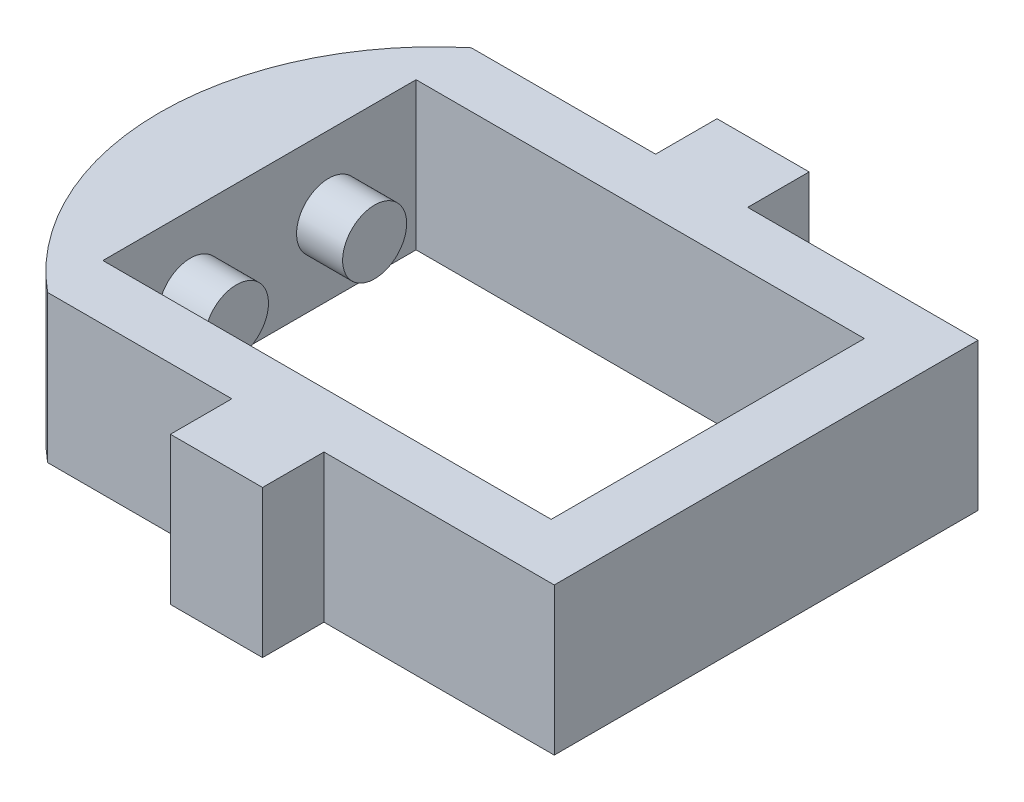
ISO-10303-21;
HEADER;
FILE_DESCRIPTION(('STEP AP214'),'2;1');
FILE_NAME('part.step','',(''),(''),'','','');
FILE_SCHEMA(('AUTOMOTIVE_DESIGN { 1 0 10303 214 1 1 1 1 }'));
ENDSEC;
DATA;
#1=APPLICATION_CONTEXT('core data for automotive mechanical design processes');
#2=APPLICATION_PROTOCOL_DEFINITION('international standard','automotive_design',2000,#1);
#3=PRODUCT_CONTEXT('',#1,'mechanical');
#4=PRODUCT('Part','Part','',(#3));
#5=PRODUCT_RELATED_PRODUCT_CATEGORY('part','',(#4));
#6=PRODUCT_DEFINITION_FORMATION('','',#4);
#7=PRODUCT_DEFINITION_CONTEXT('part definition',#1,'design');
#8=PRODUCT_DEFINITION('design','',#6,#7);
#9=PRODUCT_DEFINITION_SHAPE('','',#8);
#10=(LENGTH_UNIT() NAMED_UNIT(*) SI_UNIT(.MILLI.,.METRE.));
#11=(NAMED_UNIT(*) PLANE_ANGLE_UNIT() SI_UNIT($,.RADIAN.));
#12=(NAMED_UNIT(*) SI_UNIT($,.STERADIAN.) SOLID_ANGLE_UNIT());
#13=UNCERTAINTY_MEASURE_WITH_UNIT(LENGTH_MEASURE(1.E-05),#10,'distance_accuracy_value','');
#14=(GEOMETRIC_REPRESENTATION_CONTEXT(3) GLOBAL_UNCERTAINTY_ASSIGNED_CONTEXT((#13)) GLOBAL_UNIT_ASSIGNED_CONTEXT((#10,
#11,#12)) REPRESENTATION_CONTEXT('',''));
#15=CARTESIAN_POINT('',(0.,0.,0.));
#16=DIRECTION('',(0.,0.,1.));
#17=DIRECTION('',(1.,0.,0.));
#18=AXIS2_PLACEMENT_3D('',#15,#16,#17);
#19=CARTESIAN_POINT('',(0.,9.6,-13.8));
#20=DIRECTION('',(0.,0.,-1.));
#21=DIRECTION('',(-1.,0.,0.));
#22=AXIS2_PLACEMENT_3D('',#19,#20,#21);
#23=PLANE('',#22);
#24=DIRECTION('',(1.,0.,0.));
#25=VECTOR('',#24,1.);
#26=CARTESIAN_POINT('',(0.,0.,-13.8));
#27=LINE('',#26,#25);
#28=CARTESIAN_POINT('',(-17.9999999999994,0.,-13.8));
#29=VERTEX_POINT('',#28);
#30=CARTESIAN_POINT('',(-5.99999999999999,0.,-13.8));
#31=VERTEX_POINT('',#30);
#32=EDGE_CURVE('E214',#29,#31,#27,.T.);
#33=ORIENTED_EDGE('',*,*,#32,.F.);
#34=DIRECTION('',(0.,-1.,0.));
#35=VECTOR('',#34,1.);
#36=CARTESIAN_POINT('',(-17.9999999999994,9.6,-13.8));
#37=LINE('',#36,#35);
#38=CARTESIAN_POINT('',(-17.9999999999994,9.6,-13.8));
#39=VERTEX_POINT('',#38);
#40=EDGE_CURVE('E11',#39,#29,#37,.T.);
#41=ORIENTED_EDGE('',*,*,#40,.F.);
#42=DIRECTION('',(1.,0.,0.));
#43=VECTOR('',#42,1.);
#44=CARTESIAN_POINT('',(0.,9.6,-13.8));
#45=LINE('',#44,#43);
#46=CARTESIAN_POINT('',(-5.99999999999999,9.6,-13.8));
#47=VERTEX_POINT('',#46);
#48=EDGE_CURVE('E322',#39,#47,#45,.T.);
#49=ORIENTED_EDGE('',*,*,#48,.T.);
#50=DIRECTION('',(0.,-1.,0.));
#51=VECTOR('',#50,1.);
#52=CARTESIAN_POINT('',(-5.99999999999999,9.6,-13.8));
#53=LINE('',#52,#51);
#54=EDGE_CURVE('E64',#47,#31,#53,.T.);
#55=ORIENTED_EDGE('',*,*,#54,.T.);
#56=EDGE_LOOP('',(#33,#41,#49,#55));
#57=FACE_BOUND('',#56,.T.);
#58=ADVANCED_FACE('F44',(#57),#23,.T.);
#59=CARTESIAN_POINT('',(-6.60076923076862,9.6,0.));
#60=DIRECTION('',(0.,-1.,0.));
#61=DIRECTION('',(0.,0.,-1.));
#62=AXIS2_PLACEMENT_3D('',#59,#60,#61);
#63=CYLINDRICAL_SURFACE('',#62,17.8992307692308);
#64=CARTESIAN_POINT('',(-6.60076923076862,0.,0.));
#65=DIRECTION('',(0.,1.,0.));
#66=DIRECTION('',(0.,0.,1.));
#67=AXIS2_PLACEMENT_3D('',#64,#65,#66);
#68=CIRCLE('',#67,17.8992307692308);
#69=CARTESIAN_POINT('',(-17.9999999999994,0.,13.8));
#70=VERTEX_POINT('',#69);
#71=EDGE_CURVE('E217',#29,#70,#68,.T.);
#72=ORIENTED_EDGE('',*,*,#71,.T.);
#73=DIRECTION('',(0.,-1.,0.));
#74=VECTOR('',#73,1.);
#75=CARTESIAN_POINT('',(-17.9999999999994,9.6,13.8));
#76=LINE('',#75,#74);
#77=CARTESIAN_POINT('',(-17.9999999999994,9.6,13.8));
#78=VERTEX_POINT('',#77);
#79=EDGE_CURVE('E55',#78,#70,#76,.T.);
#80=ORIENTED_EDGE('',*,*,#79,.F.);
#81=CARTESIAN_POINT('',(-6.60076923076862,9.6,0.));
#82=DIRECTION('',(0.,1.,0.));
#83=DIRECTION('',(0.,0.,1.));
#84=AXIS2_PLACEMENT_3D('',#81,#82,#83);
#85=CIRCLE('',#84,17.8992307692308);
#86=EDGE_CURVE('E332',#39,#78,#85,.T.);
#87=ORIENTED_EDGE('',*,*,#86,.F.);
#88=ORIENTED_EDGE('',*,*,#40,.T.);
#89=EDGE_LOOP('',(#72,#80,#87,#88));
#90=FACE_BOUND('',#89,.T.);
#91=ADVANCED_FACE('F378',(#90),#63,.T.);
#92=CARTESIAN_POINT('',(0.,9.6,13.8));
#93=DIRECTION('',(0.,0.,-1.));
#94=DIRECTION('',(-1.,0.,0.));
#95=AXIS2_PLACEMENT_3D('',#92,#93,#94);
#96=PLANE('',#95);
#97=DIRECTION('',(1.,0.,0.));
#98=VECTOR('',#97,1.);
#99=CARTESIAN_POINT('',(0.,0.,13.8));
#100=LINE('',#99,#98);
#101=CARTESIAN_POINT('',(-5.99999999999999,0.,13.8));
#102=VERTEX_POINT('',#101);
#103=EDGE_CURVE('E221',#70,#102,#100,.T.);
#104=ORIENTED_EDGE('',*,*,#103,.T.);
#105=DIRECTION('',(0.,-1.,0.));
#106=VECTOR('',#105,1.);
#107=CARTESIAN_POINT('',(-5.99999999999999,9.6,13.8));
#108=LINE('',#107,#106);
#109=CARTESIAN_POINT('',(-5.99999999999999,9.6,13.8));
#110=VERTEX_POINT('',#109);
#111=EDGE_CURVE('E285',#110,#102,#108,.T.);
#112=ORIENTED_EDGE('',*,*,#111,.F.);
#113=DIRECTION('',(1.,0.,0.));
#114=VECTOR('',#113,1.);
#115=CARTESIAN_POINT('',(0.,9.6,13.8));
#116=LINE('',#115,#114);
#117=EDGE_CURVE('E336',#78,#110,#116,.T.);
#118=ORIENTED_EDGE('',*,*,#117,.F.);
#119=ORIENTED_EDGE('',*,*,#79,.T.);
#120=EDGE_LOOP('',(#104,#112,#118,#119));
#121=FACE_BOUND('',#120,.T.);
#122=ADVANCED_FACE('F383',(#121),#96,.F.);
#123=CARTESIAN_POINT('',(-5.99999999999996,9.6,0.));
#124=DIRECTION('',(1.,0.,0.));
#125=DIRECTION('',(0.,0.,-1.));
#126=AXIS2_PLACEMENT_3D('',#123,#124,#125);
#127=PLANE('',#126);
#128=DIRECTION('',(0.,0.,1.));
#129=VECTOR('',#128,1.);
#130=CARTESIAN_POINT('',(-5.99999999999996,0.,0.));
#131=LINE('',#130,#129);
#132=CARTESIAN_POINT('',(-6.,0.,17.8));
#133=VERTEX_POINT('',#132);
#134=EDGE_CURVE('E225',#102,#133,#131,.T.);
#135=ORIENTED_EDGE('',*,*,#134,.T.);
#136=DIRECTION('',(0.,-1.,0.));
#137=VECTOR('',#136,1.);
#138=CARTESIAN_POINT('',(-6.,9.6,17.8));
#139=LINE('',#138,#137);
#140=CARTESIAN_POINT('',(-6.,9.6,17.8));
#141=VERTEX_POINT('',#140);
#142=EDGE_CURVE('E281',#141,#133,#139,.T.);
#143=ORIENTED_EDGE('',*,*,#142,.F.);
#144=DIRECTION('',(0.,0.,1.));
#145=VECTOR('',#144,1.);
#146=CARTESIAN_POINT('',(-5.99999999999996,9.6,0.));
#147=LINE('',#146,#145);
#148=EDGE_CURVE('E340',#110,#141,#147,.T.);
#149=ORIENTED_EDGE('',*,*,#148,.F.);
#150=ORIENTED_EDGE('',*,*,#111,.T.);
#151=EDGE_LOOP('',(#135,#143,#149,#150));
#152=FACE_BOUND('',#151,.T.);
#153=ADVANCED_FACE('F417',(#152),#127,.F.);
#154=CARTESIAN_POINT('',(0.,9.6,17.8));
#155=DIRECTION('',(0.,0.,-1.));
#156=DIRECTION('',(-1.,0.,0.));
#157=AXIS2_PLACEMENT_3D('',#154,#155,#156);
#158=PLANE('',#157);
#159=DIRECTION('',(1.,0.,0.));
#160=VECTOR('',#159,1.);
#161=CARTESIAN_POINT('',(0.,0.,17.8));
#162=LINE('',#161,#160);
#163=CARTESIAN_POINT('',(0.,0.,17.8));
#164=VERTEX_POINT('',#163);
#165=EDGE_CURVE('E229',#133,#164,#162,.T.);
#166=ORIENTED_EDGE('',*,*,#165,.T.);
#167=DIRECTION('',(0.,-1.,0.));
#168=VECTOR('',#167,1.);
#169=CARTESIAN_POINT('',(0.,9.6,17.8));
#170=LINE('',#169,#168);
#171=CARTESIAN_POINT('',(0.,9.6,17.8));
#172=VERTEX_POINT('',#171);
#173=EDGE_CURVE('E277',#172,#164,#170,.T.);
#174=ORIENTED_EDGE('',*,*,#173,.F.);
#175=DIRECTION('',(1.,0.,0.));
#176=VECTOR('',#175,1.);
#177=CARTESIAN_POINT('',(0.,9.6,17.8));
#178=LINE('',#177,#176);
#179=EDGE_CURVE('E344',#141,#172,#178,.T.);
#180=ORIENTED_EDGE('',*,*,#179,.F.);
#181=ORIENTED_EDGE('',*,*,#142,.T.);
#182=EDGE_LOOP('',(#166,#174,#180,#181));
#183=FACE_BOUND('',#182,.T.);
#184=ADVANCED_FACE('F413',(#183),#158,.F.);
#185=CARTESIAN_POINT('',(0.,9.6,0.));
#186=DIRECTION('',(-1.,0.,0.));
#187=DIRECTION('',(0.,0.,1.));
#188=AXIS2_PLACEMENT_3D('',#185,#186,#187);
#189=PLANE('',#188);
#190=DIRECTION('',(0.,0.,-1.));
#191=VECTOR('',#190,1.);
#192=CARTESIAN_POINT('',(0.,0.,0.));
#193=LINE('',#192,#191);
#194=CARTESIAN_POINT('',(0.,0.,13.8));
#195=VERTEX_POINT('',#194);
#196=EDGE_CURVE('E233',#164,#195,#193,.T.);
#197=ORIENTED_EDGE('',*,*,#196,.T.);
#198=DIRECTION('',(0.,-1.,0.));
#199=VECTOR('',#198,1.);
#200=CARTESIAN_POINT('',(0.,9.6,13.8));
#201=LINE('',#200,#199);
#202=CARTESIAN_POINT('',(0.,9.6,13.8));
#203=VERTEX_POINT('',#202);
#204=EDGE_CURVE('E273',#203,#195,#201,.T.);
#205=ORIENTED_EDGE('',*,*,#204,.F.);
#206=DIRECTION('',(0.,0.,-1.));
#207=VECTOR('',#206,1.);
#208=CARTESIAN_POINT('',(0.,9.6,0.));
#209=LINE('',#208,#207);
#210=EDGE_CURVE('E348',#172,#203,#209,.T.);
#211=ORIENTED_EDGE('',*,*,#210,.F.);
#212=ORIENTED_EDGE('',*,*,#173,.T.);
#213=EDGE_LOOP('',(#197,#205,#211,#212));
#214=FACE_BOUND('',#213,.T.);
#215=ADVANCED_FACE('F409',(#214),#189,.F.);
#216=CARTESIAN_POINT('',(0.,9.6,13.8));
#217=DIRECTION('',(0.,0.,-1.));
#218=DIRECTION('',(-1.,0.,0.));
#219=AXIS2_PLACEMENT_3D('',#216,#217,#218);
#220=PLANE('',#219);
#221=DIRECTION('',(1.,0.,0.));
#222=VECTOR('',#221,1.);
#223=CARTESIAN_POINT('',(0.,0.,13.8));
#224=LINE('',#223,#222);
#225=CARTESIAN_POINT('',(15.,0.,13.8));
#226=VERTEX_POINT('',#225);
#227=EDGE_CURVE('E237',#195,#226,#224,.T.);
#228=ORIENTED_EDGE('',*,*,#227,.T.);
#229=DIRECTION('',(0.,-1.,0.));
#230=VECTOR('',#229,1.);
#231=CARTESIAN_POINT('',(15.,9.6,13.8));
#232=LINE('',#231,#230);
#233=CARTESIAN_POINT('',(15.,9.6,13.8));
#234=VERTEX_POINT('',#233);
#235=EDGE_CURVE('E269',#234,#226,#232,.T.);
#236=ORIENTED_EDGE('',*,*,#235,.F.);
#237=DIRECTION('',(1.,0.,0.));
#238=VECTOR('',#237,1.);
#239=CARTESIAN_POINT('',(0.,9.6,13.8));
#240=LINE('',#239,#238);
#241=EDGE_CURVE('E352',#203,#234,#240,.T.);
#242=ORIENTED_EDGE('',*,*,#241,.F.);
#243=ORIENTED_EDGE('',*,*,#204,.T.);
#244=EDGE_LOOP('',(#228,#236,#242,#243));
#245=FACE_BOUND('',#244,.T.);
#246=ADVANCED_FACE('F406',(#245),#220,.F.);
#247=CARTESIAN_POINT('',(15.,9.6,0.));
#248=DIRECTION('',(-1.,0.,0.));
#249=DIRECTION('',(0.,0.,1.));
#250=AXIS2_PLACEMENT_3D('',#247,#248,#249);
#251=PLANE('',#250);
#252=DIRECTION('',(0.,0.,-1.));
#253=VECTOR('',#252,1.);
#254=CARTESIAN_POINT('',(15.,0.,0.));
#255=LINE('',#254,#253);
#256=CARTESIAN_POINT('',(15.,0.,-13.8));
#257=VERTEX_POINT('',#256);
#258=EDGE_CURVE('E241',#226,#257,#255,.T.);
#259=ORIENTED_EDGE('',*,*,#258,.T.);
#260=DIRECTION('',(0.,-1.,0.));
#261=VECTOR('',#260,1.);
#262=CARTESIAN_POINT('',(15.,9.6,-13.8));
#263=LINE('',#262,#261);
#264=CARTESIAN_POINT('',(15.,9.6,-13.8));
#265=VERTEX_POINT('',#264);
#266=EDGE_CURVE('E265',#265,#257,#263,.T.);
#267=ORIENTED_EDGE('',*,*,#266,.F.);
#268=DIRECTION('',(0.,0.,-1.));
#269=VECTOR('',#268,1.);
#270=CARTESIAN_POINT('',(15.,9.6,0.));
#271=LINE('',#270,#269);
#272=EDGE_CURVE('E356',#234,#265,#271,.T.);
#273=ORIENTED_EDGE('',*,*,#272,.F.);
#274=ORIENTED_EDGE('',*,*,#235,.T.);
#275=EDGE_LOOP('',(#259,#267,#273,#274));
#276=FACE_BOUND('',#275,.T.);
#277=ADVANCED_FACE('F362',(#276),#251,.F.);
#278=CARTESIAN_POINT('',(0.,9.6,-13.8));
#279=DIRECTION('',(0.,0.,1.));
#280=DIRECTION('',(1.,0.,0.));
#281=AXIS2_PLACEMENT_3D('',#278,#279,#280);
#282=PLANE('',#281);
#283=DIRECTION('',(-1.,0.,0.));
#284=VECTOR('',#283,1.);
#285=CARTESIAN_POINT('',(0.,0.,-13.8));
#286=LINE('',#285,#284);
#287=CARTESIAN_POINT('',(0.,0.,-13.8));
#288=VERTEX_POINT('',#287);
#289=EDGE_CURVE('E245',#257,#288,#286,.T.);
#290=ORIENTED_EDGE('',*,*,#289,.T.);
#291=DIRECTION('',(0.,-1.,0.));
#292=VECTOR('',#291,1.);
#293=CARTESIAN_POINT('',(0.,9.6,-13.8));
#294=LINE('',#293,#292);
#295=CARTESIAN_POINT('',(0.,9.6,-13.8));
#296=VERTEX_POINT('',#295);
#297=EDGE_CURVE('E176',#296,#288,#294,.T.);
#298=ORIENTED_EDGE('',*,*,#297,.F.);
#299=DIRECTION('',(-1.,0.,0.));
#300=VECTOR('',#299,1.);
#301=CARTESIAN_POINT('',(0.,9.6,-13.8));
#302=LINE('',#301,#300);
#303=EDGE_CURVE('E185',#265,#296,#302,.T.);
#304=ORIENTED_EDGE('',*,*,#303,.F.);
#305=ORIENTED_EDGE('',*,*,#266,.T.);
#306=EDGE_LOOP('',(#290,#298,#304,#305));
#307=FACE_BOUND('',#306,.T.);
#308=ADVANCED_FACE('F364',(#307),#282,.F.);
#309=CARTESIAN_POINT('',(0.,9.6,0.));
#310=DIRECTION('',(1.,0.,0.));
#311=DIRECTION('',(0.,0.,-1.));
#312=AXIS2_PLACEMENT_3D('',#309,#310,#311);
#313=PLANE('',#312);
#314=DIRECTION('',(0.,0.,1.));
#315=VECTOR('',#314,1.);
#316=CARTESIAN_POINT('',(0.,0.,0.));
#317=LINE('',#316,#315);
#318=CARTESIAN_POINT('',(0.,0.,-17.8));
#319=VERTEX_POINT('',#318);
#320=EDGE_CURVE('E171',#319,#288,#317,.T.);
#321=ORIENTED_EDGE('',*,*,#320,.F.);
#322=DIRECTION('',(0.,-1.,0.));
#323=VECTOR('',#322,1.);
#324=CARTESIAN_POINT('',(0.,9.6,-17.8));
#325=LINE('',#324,#323);
#326=CARTESIAN_POINT('',(0.,9.6,-17.8));
#327=VERTEX_POINT('',#326);
#328=EDGE_CURVE('E166',#327,#319,#325,.T.);
#329=ORIENTED_EDGE('',*,*,#328,.F.);
#330=DIRECTION('',(0.,0.,1.));
#331=VECTOR('',#330,1.);
#332=CARTESIAN_POINT('',(0.,9.6,0.));
#333=LINE('',#332,#331);
#334=EDGE_CURVE('E169',#327,#296,#333,.T.);
#335=ORIENTED_EDGE('',*,*,#334,.T.);
#336=ORIENTED_EDGE('',*,*,#297,.T.);
#337=EDGE_LOOP('',(#321,#329,#335,#336));
#338=FACE_BOUND('',#337,.T.);
#339=ADVANCED_FACE('F168',(#338),#313,.T.);
#340=CARTESIAN_POINT('',(0.,9.6,-17.8));
#341=DIRECTION('',(0.,0.,-1.));
#342=DIRECTION('',(-1.,0.,0.));
#343=AXIS2_PLACEMENT_3D('',#340,#341,#342);
#344=PLANE('',#343);
#345=DIRECTION('',(1.,0.,0.));
#346=VECTOR('',#345,1.);
#347=CARTESIAN_POINT('',(0.,0.,-17.8));
#348=LINE('',#347,#346);
#349=CARTESIAN_POINT('',(-6.,0.,-17.8));
#350=VERTEX_POINT('',#349);
#351=EDGE_CURVE('E251',#350,#319,#348,.T.);
#352=ORIENTED_EDGE('',*,*,#351,.F.);
#353=DIRECTION('',(0.,-1.,0.));
#354=VECTOR('',#353,1.);
#355=CARTESIAN_POINT('',(-6.,9.6,-17.8));
#356=LINE('',#355,#354);
#357=CARTESIAN_POINT('',(-6.,9.6,-17.8));
#358=VERTEX_POINT('',#357);
#359=EDGE_CURVE('E113',#358,#350,#356,.T.);
#360=ORIENTED_EDGE('',*,*,#359,.F.);
#361=DIRECTION('',(1.,0.,0.));
#362=VECTOR('',#361,1.);
#363=CARTESIAN_POINT('',(0.,9.6,-17.8));
#364=LINE('',#363,#362);
#365=EDGE_CURVE('E183',#358,#327,#364,.T.);
#366=ORIENTED_EDGE('',*,*,#365,.T.);
#367=ORIENTED_EDGE('',*,*,#328,.T.);
#368=EDGE_LOOP('',(#352,#360,#366,#367));
#369=FACE_BOUND('',#368,.T.);
#370=ADVANCED_FACE('F189',(#369),#344,.T.);
#371=CARTESIAN_POINT('',(11.2,9.6,0.));
#372=DIRECTION('',(1.,0.,0.));
#373=DIRECTION('',(0.,0.,-1.));
#374=AXIS2_PLACEMENT_3D('',#371,#372,#373);
#375=PLANE('',#374);
#376=DIRECTION('',(0.,0.,1.));
#377=VECTOR('',#376,1.);
#378=CARTESIAN_POINT('',(11.2,0.,0.));
#379=LINE('',#378,#377);
#380=CARTESIAN_POINT('',(11.2,0.,-10.2));
#381=VERTEX_POINT('',#380);
#382=CARTESIAN_POINT('',(11.2,0.,10.2));
#383=VERTEX_POINT('',#382);
#384=EDGE_CURVE('E198',#381,#383,#379,.T.);
#385=ORIENTED_EDGE('',*,*,#384,.T.);
#386=DIRECTION('',(0.,-1.,0.));
#387=VECTOR('',#386,1.);
#388=CARTESIAN_POINT('',(11.2,9.6,10.2));
#389=LINE('',#388,#387);
#390=CARTESIAN_POINT('',(11.2,9.6,10.2));
#391=VERTEX_POINT('',#390);
#392=EDGE_CURVE('E48',#391,#383,#389,.T.);
#393=ORIENTED_EDGE('',*,*,#392,.F.);
#394=DIRECTION('',(0.,0.,1.));
#395=VECTOR('',#394,1.);
#396=CARTESIAN_POINT('',(11.2,9.6,0.));
#397=LINE('',#396,#395);
#398=CARTESIAN_POINT('',(11.2,9.6,-10.2));
#399=VERTEX_POINT('',#398);
#400=EDGE_CURVE('E258',#399,#391,#397,.T.);
#401=ORIENTED_EDGE('',*,*,#400,.F.);
#402=DIRECTION('',(0.,-1.,0.));
#403=VECTOR('',#402,1.);
#404=CARTESIAN_POINT('',(11.2,9.6,-10.2));
#405=LINE('',#404,#403);
#406=EDGE_CURVE('E194',#399,#381,#405,.T.);
#407=ORIENTED_EDGE('',*,*,#406,.T.);
#408=EDGE_LOOP('',(#385,#393,#401,#407));
#409=FACE_BOUND('',#408,.T.);
#410=ADVANCED_FACE('F46',(#409),#375,.F.);
#411=CARTESIAN_POINT('',(0.,9.6,10.2));
#412=DIRECTION('',(0.,0.,1.));
#413=DIRECTION('',(1.,0.,0.));
#414=AXIS2_PLACEMENT_3D('',#411,#412,#413);
#415=PLANE('',#414);
#416=DIRECTION('',(-1.,0.,0.));
#417=VECTOR('',#416,1.);
#418=CARTESIAN_POINT('',(0.,0.,10.2));
#419=LINE('',#418,#417);
#420=CARTESIAN_POINT('',(-17.9999999999994,0.,10.2));
#421=VERTEX_POINT('',#420);
#422=EDGE_CURVE('E202',#383,#421,#419,.T.);
#423=ORIENTED_EDGE('',*,*,#422,.T.);
#424=DIRECTION('',(0.,-1.,0.));
#425=VECTOR('',#424,1.);
#426=CARTESIAN_POINT('',(-17.9999999999994,9.6,10.2));
#427=LINE('',#426,#425);
#428=CARTESIAN_POINT('',(-17.9999999999994,9.6,10.2));
#429=VERTEX_POINT('',#428);
#430=EDGE_CURVE('E297',#429,#421,#427,.T.);
#431=ORIENTED_EDGE('',*,*,#430,.F.);
#432=DIRECTION('',(-1.,0.,0.));
#433=VECTOR('',#432,1.);
#434=CARTESIAN_POINT('',(0.,9.6,10.2));
#435=LINE('',#434,#433);
#436=EDGE_CURVE('E126',#391,#429,#435,.T.);
#437=ORIENTED_EDGE('',*,*,#436,.F.);
#438=ORIENTED_EDGE('',*,*,#392,.T.);
#439=EDGE_LOOP('',(#423,#431,#437,#438));
#440=FACE_BOUND('',#439,.T.);
#441=ADVANCED_FACE('F304',(#440),#415,.F.);
#442=CARTESIAN_POINT('',(-17.9999999999994,9.6,0.));
#443=DIRECTION('',(1.,0.,0.));
#444=DIRECTION('',(0.,0.,-1.));
#445=AXIS2_PLACEMENT_3D('',#442,#443,#444);
#446=PLANE('',#445);
#447=CARTESIAN_POINT('',(-17.9999999999994,4.8,-4.5));
#448=DIRECTION('',(1.,0.,0.));
#449=DIRECTION('',(0.,0.,-1.));
#450=AXIS2_PLACEMENT_3D('',#447,#448,#449);
#451=CIRCLE('',#450,2.085);
#452=CARTESIAN_POINT('',(-17.9999999999994,4.8,-6.585));
#453=VERTEX_POINT('',#452);
#454=EDGE_CURVE('E634',#453,#453,#451,.T.);
#455=ORIENTED_EDGE('',*,*,#454,.F.);
#456=EDGE_LOOP('',(#455));
#457=FACE_BOUND('',#456,.T.);
#458=CARTESIAN_POINT('',(-17.9999999999994,4.8,4.5));
#459=DIRECTION('',(1.,0.,0.));
#460=DIRECTION('',(0.,0.,-1.));
#461=AXIS2_PLACEMENT_3D('',#458,#459,#460);
#462=CIRCLE('',#461,2.085);
#463=CARTESIAN_POINT('',(-17.9999999999994,4.8,2.415));
#464=VERTEX_POINT('',#463);
#465=EDGE_CURVE('E638',#464,#464,#462,.T.);
#466=ORIENTED_EDGE('',*,*,#465,.F.);
#467=EDGE_LOOP('',(#466));
#468=FACE_BOUND('',#467,.T.);
#469=DIRECTION('',(0.,0.,1.));
#470=VECTOR('',#469,1.);
#471=CARTESIAN_POINT('',(-17.9999999999994,0.,0.));
#472=LINE('',#471,#470);
#473=CARTESIAN_POINT('',(-17.9999999999994,0.,-10.2));
#474=VERTEX_POINT('',#473);
#475=EDGE_CURVE('E207',#474,#421,#472,.T.);
#476=ORIENTED_EDGE('',*,*,#475,.F.);
#477=DIRECTION('',(0.,-1.,0.));
#478=VECTOR('',#477,1.);
#479=CARTESIAN_POINT('',(-17.9999999999994,9.6,-10.2));
#480=LINE('',#479,#478);
#481=CARTESIAN_POINT('',(-17.9999999999994,9.6,-10.2));
#482=VERTEX_POINT('',#481);
#483=EDGE_CURVE('E295',#482,#474,#480,.T.);
#484=ORIENTED_EDGE('',*,*,#483,.F.);
#485=DIRECTION('',(0.,0.,1.));
#486=VECTOR('',#485,1.);
#487=CARTESIAN_POINT('',(-17.9999999999994,9.6,0.));
#488=LINE('',#487,#486);
#489=EDGE_CURVE('E316',#482,#429,#488,.T.);
#490=ORIENTED_EDGE('',*,*,#489,.T.);
#491=ORIENTED_EDGE('',*,*,#430,.T.);
#492=EDGE_LOOP('',(#476,#484,#490,#491));
#493=FACE_BOUND('',#492,.T.);
#494=ADVANCED_FACE('F313',(#457,#468,#493),#446,.T.);
#495=CARTESIAN_POINT('',(0.,9.6,-10.2));
#496=DIRECTION('',(0.,0.,-1.));
#497=DIRECTION('',(-1.,0.,0.));
#498=AXIS2_PLACEMENT_3D('',#495,#496,#497);
#499=PLANE('',#498);
#500=DIRECTION('',(1.,0.,0.));
#501=VECTOR('',#500,1.);
#502=CARTESIAN_POINT('',(0.,0.,-10.2));
#503=LINE('',#502,#501);
#504=EDGE_CURVE('E211',#474,#381,#503,.T.);
#505=ORIENTED_EDGE('',*,*,#504,.T.);
#506=ORIENTED_EDGE('',*,*,#406,.F.);
#507=DIRECTION('',(1.,0.,0.));
#508=VECTOR('',#507,1.);
#509=CARTESIAN_POINT('',(0.,9.6,-10.2));
#510=LINE('',#509,#508);
#511=EDGE_CURVE('E318',#482,#399,#510,.T.);
#512=ORIENTED_EDGE('',*,*,#511,.F.);
#513=ORIENTED_EDGE('',*,*,#483,.T.);
#514=EDGE_LOOP('',(#505,#506,#512,#513));
#515=FACE_BOUND('',#514,.T.);
#516=ADVANCED_FACE('F319',(#515),#499,.F.);
#517=CARTESIAN_POINT('',(-5.99999999999996,9.6,0.));
#518=DIRECTION('',(-1.,0.,0.));
#519=DIRECTION('',(0.,0.,1.));
#520=AXIS2_PLACEMENT_3D('',#517,#518,#519);
#521=PLANE('',#520);
#522=DIRECTION('',(0.,0.,-1.));
#523=VECTOR('',#522,1.);
#524=CARTESIAN_POINT('',(-5.99999999999996,0.,0.));
#525=LINE('',#524,#523);
#526=EDGE_CURVE('E254',#31,#350,#525,.T.);
#527=ORIENTED_EDGE('',*,*,#526,.F.);
#528=ORIENTED_EDGE('',*,*,#54,.F.);
#529=DIRECTION('',(0.,0.,-1.));
#530=VECTOR('',#529,1.);
#531=CARTESIAN_POINT('',(-5.99999999999996,9.6,0.));
#532=LINE('',#531,#530);
#533=EDGE_CURVE('E191',#47,#358,#532,.T.);
#534=ORIENTED_EDGE('',*,*,#533,.T.);
#535=ORIENTED_EDGE('',*,*,#359,.T.);
#536=EDGE_LOOP('',(#527,#528,#534,#535));
#537=FACE_BOUND('',#536,.T.);
#538=ADVANCED_FACE('F366',(#537),#521,.T.);
#539=CARTESIAN_POINT('',(0.,9.6,0.));
#540=DIRECTION('',(0.,1.,0.));
#541=DIRECTION('',(0.,0.,1.));
#542=AXIS2_PLACEMENT_3D('',#539,#540,#541);
#543=PLANE('',#542);
#544=ORIENTED_EDGE('',*,*,#400,.T.);
#545=ORIENTED_EDGE('',*,*,#436,.T.);
#546=ORIENTED_EDGE('',*,*,#489,.F.);
#547=ORIENTED_EDGE('',*,*,#511,.T.);
#548=EDGE_LOOP('',(#544,#545,#546,#547));
#549=FACE_BOUND('',#548,.T.);
#550=ORIENTED_EDGE('',*,*,#48,.F.);
#551=ORIENTED_EDGE('',*,*,#86,.T.);
#552=ORIENTED_EDGE('',*,*,#117,.T.);
#553=ORIENTED_EDGE('',*,*,#148,.T.);
#554=ORIENTED_EDGE('',*,*,#179,.T.);
#555=ORIENTED_EDGE('',*,*,#210,.T.);
#556=ORIENTED_EDGE('',*,*,#241,.T.);
#557=ORIENTED_EDGE('',*,*,#272,.T.);
#558=ORIENTED_EDGE('',*,*,#303,.T.);
#559=ORIENTED_EDGE('',*,*,#334,.F.);
#560=ORIENTED_EDGE('',*,*,#365,.F.);
#561=ORIENTED_EDGE('',*,*,#533,.F.);
#562=EDGE_LOOP('',(#550,#551,#552,#553,#554,#555,#556,#557,#558,#559,#560,#561));
#563=FACE_BOUND('',#562,.T.);
#564=ADVANCED_FACE('F181',(#549,#563),#543,.T.);
#565=CARTESIAN_POINT('',(0.,0.,0.));
#566=DIRECTION('',(0.,1.,0.));
#567=DIRECTION('',(0.,0.,1.));
#568=AXIS2_PLACEMENT_3D('',#565,#566,#567);
#569=PLANE('',#568);
#570=ORIENTED_EDGE('',*,*,#384,.F.);
#571=ORIENTED_EDGE('',*,*,#504,.F.);
#572=ORIENTED_EDGE('',*,*,#475,.T.);
#573=ORIENTED_EDGE('',*,*,#422,.F.);
#574=EDGE_LOOP('',(#570,#571,#572,#573));
#575=FACE_BOUND('',#574,.T.);
#576=ORIENTED_EDGE('',*,*,#32,.T.);
#577=ORIENTED_EDGE('',*,*,#526,.T.);
#578=ORIENTED_EDGE('',*,*,#351,.T.);
#579=ORIENTED_EDGE('',*,*,#320,.T.);
#580=ORIENTED_EDGE('',*,*,#289,.F.);
#581=ORIENTED_EDGE('',*,*,#258,.F.);
#582=ORIENTED_EDGE('',*,*,#227,.F.);
#583=ORIENTED_EDGE('',*,*,#196,.F.);
#584=ORIENTED_EDGE('',*,*,#165,.F.);
#585=ORIENTED_EDGE('',*,*,#134,.F.);
#586=ORIENTED_EDGE('',*,*,#103,.F.);
#587=ORIENTED_EDGE('',*,*,#71,.F.);
#588=EDGE_LOOP('',(#576,#577,#578,#579,#580,#581,#582,#583,#584,#585,#586,#587));
#589=FACE_BOUND('',#588,.T.);
#590=ADVANCED_FACE('F311',(#575,#589),#569,.F.);
#591=CARTESIAN_POINT('',(-14.9999999999994,4.8,4.5));
#592=DIRECTION('',(-1.,0.,0.));
#593=DIRECTION('',(0.,0.,1.));
#594=AXIS2_PLACEMENT_3D('',#591,#592,#593);
#595=CYLINDRICAL_SURFACE('',#594,2.085);
#596=CARTESIAN_POINT('',(-14.9999999999994,4.8,4.5));
#597=DIRECTION('',(1.,0.,0.));
#598=DIRECTION('',(0.,0.,-1.));
#599=AXIS2_PLACEMENT_3D('',#596,#597,#598);
#600=CIRCLE('',#599,2.085);
#601=CARTESIAN_POINT('',(-14.9999999999994,4.8,2.415));
#602=VERTEX_POINT('',#601);
#603=EDGE_CURVE('E203',#602,#602,#600,.T.);
#604=ORIENTED_EDGE('',*,*,#603,.F.);
#605=EDGE_LOOP('',(#604));
#606=FACE_BOUND('',#605,.T.);
#607=ORIENTED_EDGE('',*,*,#465,.T.);
#608=EDGE_LOOP('',(#607));
#609=FACE_BOUND('',#608,.T.);
#610=ADVANCED_FACE('F507',(#606,#609),#595,.T.);
#611=CARTESIAN_POINT('',(-14.9999999999994,4.8,4.5));
#612=DIRECTION('',(1.,0.,0.));
#613=DIRECTION('',(0.,0.,-1.));
#614=AXIS2_PLACEMENT_3D('',#611,#612,#613);
#615=PLANE('',#614);
#616=ORIENTED_EDGE('',*,*,#603,.T.);
#617=EDGE_LOOP('',(#616));
#618=FACE_BOUND('',#617,.T.);
#619=ADVANCED_FACE('F521',(#618),#615,.T.);
#620=CARTESIAN_POINT('',(-14.9999999999994,4.8,-4.5));
#621=DIRECTION('',(-1.,0.,0.));
#622=DIRECTION('',(0.,0.,1.));
#623=AXIS2_PLACEMENT_3D('',#620,#621,#622);
#624=CYLINDRICAL_SURFACE('',#623,2.085);
#625=CARTESIAN_POINT('',(-14.9999999999994,4.8,-4.5));
#626=DIRECTION('',(1.,0.,0.));
#627=DIRECTION('',(0.,0.,-1.));
#628=AXIS2_PLACEMENT_3D('',#625,#626,#627);
#629=CIRCLE('',#628,2.085);
#630=CARTESIAN_POINT('',(-14.9999999999994,4.8,-6.585));
#631=VERTEX_POINT('',#630);
#632=EDGE_CURVE('E632',#631,#631,#629,.T.);
#633=ORIENTED_EDGE('',*,*,#632,.F.);
#634=EDGE_LOOP('',(#633));
#635=FACE_BOUND('',#634,.T.);
#636=ORIENTED_EDGE('',*,*,#454,.T.);
#637=EDGE_LOOP('',(#636));
#638=FACE_BOUND('',#637,.T.);
#639=ADVANCED_FACE('F532',(#635,#638),#624,.T.);
#640=CARTESIAN_POINT('',(-14.9999999999994,4.8,-4.5));
#641=DIRECTION('',(1.,0.,0.));
#642=DIRECTION('',(0.,0.,-1.));
#643=AXIS2_PLACEMENT_3D('',#640,#641,#642);
#644=PLANE('',#643);
#645=ORIENTED_EDGE('',*,*,#632,.T.);
#646=EDGE_LOOP('',(#645));
#647=FACE_BOUND('',#646,.T.);
#648=ADVANCED_FACE('F543',(#647),#644,.T.);
#649=CLOSED_SHELL('',(#58,#91,#122,#153,#184,#215,#246,#277,#308,#339,#370,#410,#441,#494,#516,
#538,#564,#590,#610,#619,#639,#648));
#650=MANIFOLD_SOLID_BREP('B2',#649);
#651=ADVANCED_BREP_SHAPE_REPRESENTATION('',(#18,#650),#14);
#652=SHAPE_DEFINITION_REPRESENTATION(#9,#651);
ENDSEC;
END-ISO-10303-21;
